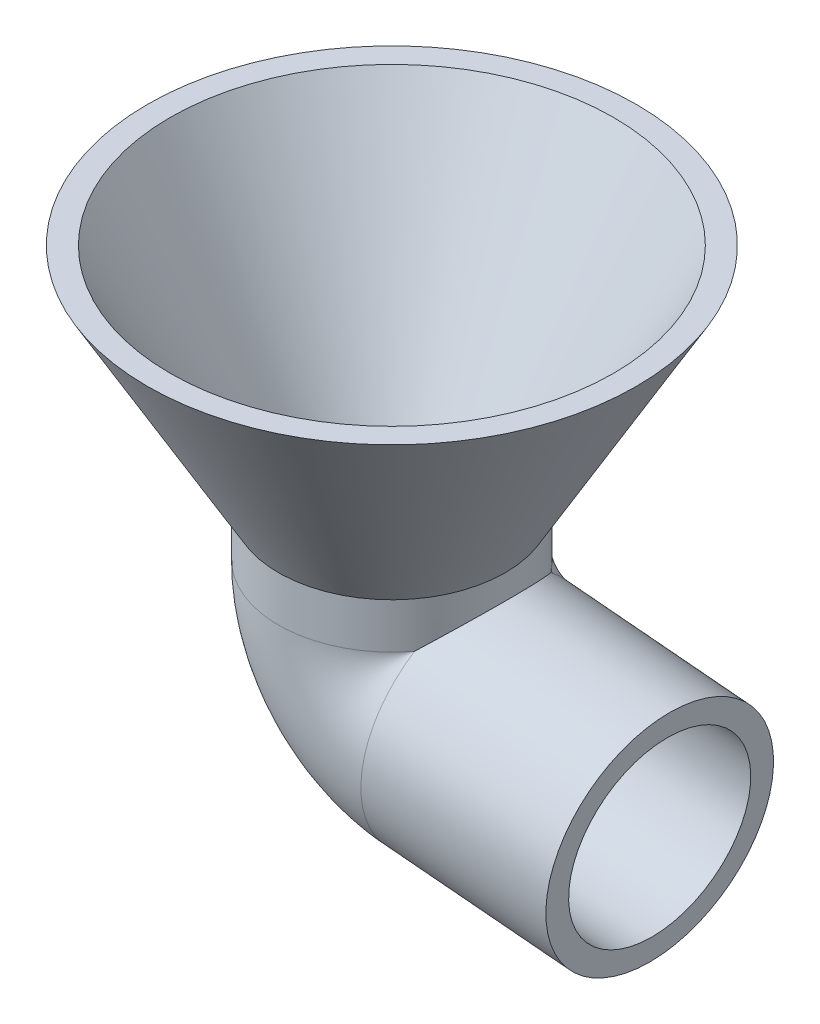
ISO-10303-21;
HEADER;
FILE_DESCRIPTION(('STEP AP214'),'2;1');
FILE_NAME('part.step','',(''),(''),'','','');
FILE_SCHEMA(('AUTOMOTIVE_DESIGN { 1 0 10303 214 1 1 1 1 }'));
ENDSEC;
DATA;
#1=APPLICATION_CONTEXT('core data for automotive mechanical design processes');
#2=APPLICATION_PROTOCOL_DEFINITION('international standard','automotive_design',2000,#1);
#3=PRODUCT_CONTEXT('',#1,'mechanical');
#4=PRODUCT('Part','Part','',(#3));
#5=PRODUCT_RELATED_PRODUCT_CATEGORY('part','',(#4));
#6=PRODUCT_DEFINITION_FORMATION('','',#4);
#7=PRODUCT_DEFINITION_CONTEXT('part definition',#1,'design');
#8=PRODUCT_DEFINITION('design','',#6,#7);
#9=PRODUCT_DEFINITION_SHAPE('','',#8);
#10=(LENGTH_UNIT() NAMED_UNIT(*) SI_UNIT(.MILLI.,.METRE.));
#11=(NAMED_UNIT(*) PLANE_ANGLE_UNIT() SI_UNIT($,.RADIAN.));
#12=(NAMED_UNIT(*) SI_UNIT($,.STERADIAN.) SOLID_ANGLE_UNIT());
#13=UNCERTAINTY_MEASURE_WITH_UNIT(LENGTH_MEASURE(1.E-05),#10,'distance_accuracy_value','');
#14=(GEOMETRIC_REPRESENTATION_CONTEXT(3) GLOBAL_UNCERTAINTY_ASSIGNED_CONTEXT((#13)) GLOBAL_UNIT_ASSIGNED_CONTEXT((#10,
#11,#12)) REPRESENTATION_CONTEXT('',''));
#15=CARTESIAN_POINT('',(0.,0.,0.));
#16=DIRECTION('',(0.,0.,1.));
#17=DIRECTION('',(1.,0.,0.));
#18=AXIS2_PLACEMENT_3D('',#15,#16,#17);
#19=CARTESIAN_POINT('',(-48.8675134594811,50.,0.));
#20=DIRECTION('',(0.,-1.,0.));
#21=DIRECTION('',(1.,0.,0.));
#22=AXIS2_PLACEMENT_3D('',#19,#20,#21);
#23=PLANE('',#22);
#24=CARTESIAN_POINT('',(-1.71454689373137E-13,50.0000000000002,0.));
#25=DIRECTION('',(0.,-1.,0.));
#26=DIRECTION('',(1.,0.,0.));
#27=AXIS2_PLACEMENT_3D('',#24,#25,#26);
#28=CIRCLE('',#27,53.867513459481);
#29=CARTESIAN_POINT('',(53.8675134594808,50.0000000000004,0.));
#30=VERTEX_POINT('',#29);
#31=EDGE_CURVE('E12',#30,#30,#28,.T.);
#32=ORIENTED_EDGE('',*,*,#31,.F.);
#33=EDGE_LOOP('',(#32));
#34=FACE_BOUND('',#33,.T.);
#35=CARTESIAN_POINT('',(-1.71454689373137E-13,50.0000000000002,0.));
#36=DIRECTION('',(0.,-1.,0.));
#37=DIRECTION('',(1.,0.,0.));
#38=AXIS2_PLACEMENT_3D('',#35,#36,#37);
#39=CIRCLE('',#38,48.867513459481);
#40=CARTESIAN_POINT('',(48.8675134594808,50.0000000000003,0.));
#41=VERTEX_POINT('',#40);
#42=EDGE_CURVE('E107',#41,#41,#39,.T.);
#43=ORIENTED_EDGE('',*,*,#42,.T.);
#44=EDGE_LOOP('',(#43));
#45=FACE_BOUND('',#44,.T.);
#46=ADVANCED_FACE('F51',(#34,#45),#23,.F.);
#47=CARTESIAN_POINT('',(-1.71454689373137E-13,50.0000000000002,0.));
#48=DIRECTION('',(0.,1.,0.));
#49=DIRECTION('',(-1.,0.,0.));
#50=AXIS2_PLACEMENT_3D('',#47,#48,#49);
#51=CONICAL_SURFACE('',#50,53.867513459481,0.523598775598293);
#52=CARTESIAN_POINT('',(0.,0.,0.));
#53=DIRECTION('',(0.,-1.,0.));
#54=DIRECTION('',(1.,0.,0.));
#55=AXIS2_PLACEMENT_3D('',#52,#53,#54);
#56=CIRCLE('',#55,25.);
#57=CARTESIAN_POINT('',(25.,1.65331455377399E-13,0.));
#58=VERTEX_POINT('',#57);
#59=EDGE_CURVE('E59',#58,#58,#56,.T.);
#60=ORIENTED_EDGE('',*,*,#59,.F.);
#61=EDGE_LOOP('',(#60));
#62=FACE_BOUND('',#61,.T.);
#63=ORIENTED_EDGE('',*,*,#31,.T.);
#64=EDGE_LOOP('',(#63));
#65=FACE_BOUND('',#64,.T.);
#66=ADVANCED_FACE('F116',(#62,#65),#51,.T.);
#67=CARTESIAN_POINT('',(0.,0.,0.));
#68=DIRECTION('',(0.,1.,0.));
#69=DIRECTION('',(-1.,0.,0.));
#70=AXIS2_PLACEMENT_3D('',#67,#68,#69);
#71=CONICAL_SURFACE('',#70,20.,0.523598775598293);
#72=ORIENTED_EDGE('',*,*,#42,.F.);
#73=EDGE_LOOP('',(#72));
#74=FACE_BOUND('',#73,.T.);
#75=CARTESIAN_POINT('',(0.,0.,0.));
#76=DIRECTION('',(0.,1.,0.));
#77=DIRECTION('',(-1.,0.,0.));
#78=AXIS2_PLACEMENT_3D('',#75,#76,#77);
#79=CIRCLE('',#78,20.);
#80=CARTESIAN_POINT('',(-20.,0.,0.));
#81=VERTEX_POINT('',#80);
#82=EDGE_CURVE('E82',#81,#81,#79,.T.);
#83=ORIENTED_EDGE('',*,*,#82,.F.);
#84=EDGE_LOOP('',(#83));
#85=FACE_BOUND('',#84,.T.);
#86=ADVANCED_FACE('F119',(#74,#85),#71,.F.);
#87=CARTESIAN_POINT('',(18.2568851450469,-29.9238939618349,0.));
#88=DIRECTION('',(0.996194698091746,-0.0871557427476543,0.));
#89=DIRECTION('',(0.0871557427476543,0.996194698091746,0.));
#90=AXIS2_PLACEMENT_3D('',#87,#88,#89);
#91=CYLINDRICAL_SURFACE('',#90,25.);
#92=CARTESIAN_POINT('',(59.04059138407,-33.4920059143208,0.));
#93=DIRECTION('',(-0.996194698091746,0.0871557427476548,0.));
#94=DIRECTION('',(-0.0871557427476548,-0.996194698091746,0.));
#95=AXIS2_PLACEMENT_3D('',#92,#93,#94);
#96=CIRCLE('',#95,25.);
#97=CARTESIAN_POINT('',(56.8616978153786,-58.3968733666144,0.));
#98=VERTEX_POINT('',#97);
#99=EDGE_CURVE('E101',#98,#98,#96,.T.);
#100=ORIENTED_EDGE('',*,*,#99,.T.);
#101=EDGE_LOOP('',(#100));
#102=FACE_BOUND('',#101,.T.);
#103=CARTESIAN_POINT('',(18.2568851450469,-29.9238939618349,0.));
#104=DIRECTION('',(-0.996194698091746,0.0871557427476547,0.));
#105=DIRECTION('',(-0.0871557427476547,-0.996194698091746,0.));
#106=AXIS2_PLACEMENT_3D('',#103,#104,#105);
#107=CIRCLE('',#106,25.);
#108=CARTESIAN_POINT('',(20.,-10.0000000000001,-15.0000000000001));
#109=VERTEX_POINT('',#108);
#110=CARTESIAN_POINT('',(20.,-10.,15.));
#111=VERTEX_POINT('',#110);
#112=EDGE_CURVE('E97',#109,#111,#107,.T.);
#113=ORIENTED_EDGE('',*,*,#112,.F.);
#114=CARTESIAN_POINT('',(0.,-28.3266234803485,0.));
#115=DIRECTION('',(0.675590207615662,-0.737277336810123,0.));
#116=DIRECTION('',(-0.737277336810123,-0.675590207615662,0.));
#117=AXIS2_PLACEMENT_3D('',#114,#115,#116);
#118=ELLIPSE('',#117,33.9085426227315,25.);
#119=EDGE_CURVE('E65',#109,#111,#118,.T.);
#120=ORIENTED_EDGE('',*,*,#119,.T.);
#121=EDGE_LOOP('',(#113,#120));
#122=FACE_BOUND('',#121,.T.);
#123=ADVANCED_FACE('F128',(#102,#122),#91,.T.);
#124=CARTESIAN_POINT('',(0.,0.,0.));
#125=DIRECTION('',(0.,-1.,0.));
#126=DIRECTION('',(1.,0.,0.));
#127=AXIS2_PLACEMENT_3D('',#124,#125,#126);
#128=CYLINDRICAL_SURFACE('',#127,25.);
#129=ORIENTED_EDGE('',*,*,#59,.T.);
#130=EDGE_LOOP('',(#129));
#131=FACE_BOUND('',#130,.T.);
#132=ORIENTED_EDGE('',*,*,#119,.F.);
#133=CARTESIAN_POINT('',(0.,-10.,0.));
#134=DIRECTION('',(0.,-1.,0.));
#135=DIRECTION('',(1.,0.,0.));
#136=AXIS2_PLACEMENT_3D('',#133,#134,#135);
#137=CIRCLE('',#136,25.);
#138=EDGE_CURVE('E94',#109,#111,#137,.F.);
#139=ORIENTED_EDGE('',*,*,#138,.T.);
#140=EDGE_LOOP('',(#132,#139));
#141=FACE_BOUND('',#140,.T.);
#142=ADVANCED_FACE('F114',(#131,#141),#128,.T.);
#143=CARTESIAN_POINT('',(59.04059138407,-33.4920059143208,0.));
#144=DIRECTION('',(-0.996194698091746,0.0871557427476548,0.));
#145=DIRECTION('',(-0.0871557427476548,-0.996194698091746,0.));
#146=AXIS2_PLACEMENT_3D('',#143,#144,#145);
#147=PLANE('',#146);
#148=CARTESIAN_POINT('',(59.04059138407,-33.4920059143208,0.));
#149=DIRECTION('',(-0.996194698091746,0.0871557427476548,0.));
#150=DIRECTION('',(-0.0871557427476548,-0.996194698091746,0.));
#151=AXIS2_PLACEMENT_3D('',#148,#149,#150);
#152=CIRCLE('',#151,20.);
#153=CARTESIAN_POINT('',(57.2974765291169,-53.4158998761557,0.));
#154=VERTEX_POINT('',#153);
#155=EDGE_CURVE('E86',#154,#154,#152,.T.);
#156=ORIENTED_EDGE('',*,*,#155,.T.);
#157=EDGE_LOOP('',(#156));
#158=FACE_BOUND('',#157,.T.);
#159=ORIENTED_EDGE('',*,*,#99,.F.);
#160=EDGE_LOOP('',(#159));
#161=FACE_BOUND('',#160,.T.);
#162=ADVANCED_FACE('F141',(#158,#161),#147,.F.);
#163=CARTESIAN_POINT('',(40.,-10.,0.));
#164=DIRECTION('',(0.,-1.,0.));
#165=DIRECTION('',(1.,0.,0.));
#166=AXIS2_PLACEMENT_3D('',#163,#164,#165);
#167=CIRCLE('',#166,25.);
#168=TRIMMED_CURVE('',#167,(PARAMETER_VALUE(-2.49809154479651)),
(PARAMETER_VALUE(2.49809154479651)),.T.,.PARAMETER.);
#169=CARTESIAN_POINT('',(20.,-10.,0.));
#170=DIRECTION('',(0.,0.,1.));
#171=AXIS1_PLACEMENT('',#169,#170);
#172=SURFACE_OF_REVOLUTION('',#168,#171);
#173=ORIENTED_EDGE('',*,*,#112,.T.);
#174=ORIENTED_EDGE('',*,*,#138,.F.);
#175=EDGE_LOOP('',(#173,#174));
#176=FACE_BOUND('',#175,.T.);
#177=ADVANCED_FACE('F133',(#176),#172,.T.);
#178=CARTESIAN_POINT('',(0.,0.,0.));
#179=DIRECTION('',(0.,-1.,0.));
#180=DIRECTION('',(1.,0.,0.));
#181=AXIS2_PLACEMENT_3D('',#178,#179,#180);
#182=CYLINDRICAL_SURFACE('',#181,20.);
#183=CARTESIAN_POINT('',(0.,-10.,0.));
#184=DIRECTION('',(0.,1.,0.));
#185=DIRECTION('',(-1.,0.,0.));
#186=AXIS2_PLACEMENT_3D('',#183,#184,#185);
#187=CIRCLE('',#186,20.);
#188=CARTESIAN_POINT('',(20.,-10.,0.));
#189=VERTEX_POINT('',#188);
#190=EDGE_CURVE('E74',#189,#189,#187,.T.);
#191=ORIENTED_EDGE('',*,*,#190,.F.);
#192=EDGE_LOOP('',(#191));
#193=FACE_BOUND('',#192,.T.);
#194=ORIENTED_EDGE('',*,*,#82,.T.);
#195=EDGE_LOOP('',(#194));
#196=FACE_BOUND('',#195,.T.);
#197=ADVANCED_FACE('F75',(#193,#196),#182,.F.);
#198=CARTESIAN_POINT('',(20.,-10.,0.));
#199=DIRECTION('',(0.,0.,1.));
#200=DIRECTION('',(1.,0.,0.));
#201=AXIS2_PLACEMENT_3D('',#198,#199,#200);
#202=TOROIDAL_SURFACE('',#201,20.,20.);
#203=CARTESIAN_POINT('',(18.2568851450469,-29.9238939618349,0.));
#204=DIRECTION('',(-0.996194698091746,0.0871557427476548,0.));
#205=DIRECTION('',(-0.0871557427476548,-0.996194698091746,0.));
#206=AXIS2_PLACEMENT_3D('',#203,#204,#205);
#207=CIRCLE('',#206,20.);
#208=EDGE_CURVE('E81',#189,#189,#207,.T.);
#209=ORIENTED_EDGE('',*,*,#208,.F.);
#210=ORIENTED_EDGE('',*,*,#190,.T.);
#211=EDGE_LOOP('',(#209,#210));
#212=FACE_BOUND('',#211,.T.);
#213=ADVANCED_FACE('F132',(#212),#202,.F.);
#214=CARTESIAN_POINT('',(18.2568851450469,-29.9238939618349,0.));
#215=DIRECTION('',(0.996194698091746,-0.0871557427476543,0.));
#216=DIRECTION('',(0.0871557427476543,0.996194698091746,0.));
#217=AXIS2_PLACEMENT_3D('',#214,#215,#216);
#218=CYLINDRICAL_SURFACE('',#217,20.);
#219=ORIENTED_EDGE('',*,*,#155,.F.);
#220=EDGE_LOOP('',(#219));
#221=FACE_BOUND('',#220,.T.);
#222=ORIENTED_EDGE('',*,*,#208,.T.);
#223=EDGE_LOOP('',(#222));
#224=FACE_BOUND('',#223,.T.);
#225=ADVANCED_FACE('F139',(#221,#224),#218,.F.);
#226=CLOSED_SHELL('',(#46,#66,#86,#123,#142,#162,#177,#197,#213,#225));
#227=MANIFOLD_SOLID_BREP('B2',#226);
#228=ADVANCED_BREP_SHAPE_REPRESENTATION('',(#18,#227),#14);
#229=SHAPE_DEFINITION_REPRESENTATION(#9,#228);
ENDSEC;
END-ISO-10303-21;
